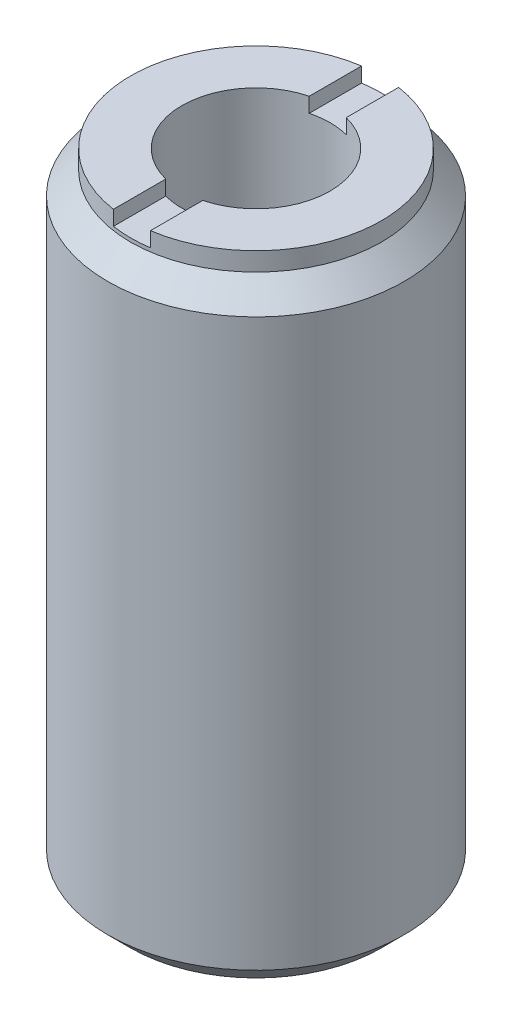
ISO-10303-21;
HEADER;
FILE_DESCRIPTION(('STEP AP214'),'2;1');
FILE_NAME('part.step','',(''),(''),'','','');
FILE_SCHEMA(('AUTOMOTIVE_DESIGN { 1 0 10303 214 1 1 1 1 }'));
ENDSEC;
DATA;
#1=APPLICATION_CONTEXT('core data for automotive mechanical design processes');
#2=APPLICATION_PROTOCOL_DEFINITION('international standard','automotive_design',2000,#1);
#3=PRODUCT_CONTEXT('',#1,'mechanical');
#4=PRODUCT('Part','Part','',(#3));
#5=PRODUCT_RELATED_PRODUCT_CATEGORY('part','',(#4));
#6=PRODUCT_DEFINITION_FORMATION('','',#4);
#7=PRODUCT_DEFINITION_CONTEXT('part definition',#1,'design');
#8=PRODUCT_DEFINITION('design','',#6,#7);
#9=PRODUCT_DEFINITION_SHAPE('','',#8);
#10=(LENGTH_UNIT() NAMED_UNIT(*) SI_UNIT(.MILLI.,.METRE.));
#11=(NAMED_UNIT(*) PLANE_ANGLE_UNIT() SI_UNIT($,.RADIAN.));
#12=(NAMED_UNIT(*) SI_UNIT($,.STERADIAN.) SOLID_ANGLE_UNIT());
#13=UNCERTAINTY_MEASURE_WITH_UNIT(LENGTH_MEASURE(1.E-05),#10,'distance_accuracy_value','');
#14=(GEOMETRIC_REPRESENTATION_CONTEXT(3) GLOBAL_UNCERTAINTY_ASSIGNED_CONTEXT((#13)) GLOBAL_UNIT_ASSIGNED_CONTEXT((#10,
#11,#12)) REPRESENTATION_CONTEXT('',''));
#15=CARTESIAN_POINT('',(0.,0.,0.));
#16=DIRECTION('',(0.,0.,1.));
#17=DIRECTION('',(1.,0.,0.));
#18=AXIS2_PLACEMENT_3D('',#15,#16,#17);
#19=CARTESIAN_POINT('',(0.,31.773,0.));
#20=DIRECTION('',(0.,-1.,0.));
#21=DIRECTION('',(0.,0.,-1.));
#22=AXIS2_PLACEMENT_3D('',#19,#20,#21);
#23=CONICAL_SURFACE('',#22,8.,0.785398163397449);
#24=CARTESIAN_POINT('',(0.,33.,0.));
#25=DIRECTION('',(0.,-1.,0.));
#26=DIRECTION('',(0.,0.,-1.));
#27=AXIS2_PLACEMENT_3D('',#24,#25,#26);
#28=CIRCLE('',#27,6.773);
#29=CARTESIAN_POINT('',(0.,33.,-6.773));
#30=VERTEX_POINT('',#29);
#31=EDGE_CURVE('E111',#30,#30,#28,.T.);
#32=ORIENTED_EDGE('',*,*,#31,.T.);
#33=EDGE_LOOP('',(#32));
#34=FACE_BOUND('',#33,.T.);
#35=CARTESIAN_POINT('',(0.,31.773,0.));
#36=DIRECTION('',(0.,-1.,0.));
#37=DIRECTION('',(0.,0.,-1.));
#38=AXIS2_PLACEMENT_3D('',#35,#36,#37);
#39=CIRCLE('',#38,8.);
#40=CARTESIAN_POINT('',(0.,31.773,-8.));
#41=VERTEX_POINT('',#40);
#42=EDGE_CURVE('E11',#41,#41,#39,.T.);
#43=ORIENTED_EDGE('',*,*,#42,.F.);
#44=EDGE_LOOP('',(#43));
#45=FACE_BOUND('',#44,.T.);
#46=ADVANCED_FACE('F17',(#34,#45),#23,.T.);
#47=CARTESIAN_POINT('',(0.,0.,0.));
#48=DIRECTION('',(0.,1.,0.));
#49=DIRECTION('',(0.,0.,-1.));
#50=AXIS2_PLACEMENT_3D('',#47,#48,#49);
#51=CYLINDRICAL_SURFACE('',#50,8.);
#52=ORIENTED_EDGE('',*,*,#42,.T.);
#53=EDGE_LOOP('',(#52));
#54=FACE_BOUND('',#53,.T.);
#55=CARTESIAN_POINT('',(0.,1.227,0.));
#56=DIRECTION('',(0.,-1.,0.));
#57=DIRECTION('',(0.,0.,-1.));
#58=AXIS2_PLACEMENT_3D('',#55,#56,#57);
#59=CIRCLE('',#58,8.);
#60=CARTESIAN_POINT('',(0.,1.227,-8.));
#61=VERTEX_POINT('',#60);
#62=EDGE_CURVE('E21',#61,#61,#59,.T.);
#63=ORIENTED_EDGE('',*,*,#62,.F.);
#64=EDGE_LOOP('',(#63));
#65=FACE_BOUND('',#64,.T.);
#66=ADVANCED_FACE('F205',(#54,#65),#51,.T.);
#67=CARTESIAN_POINT('',(0.,0.,0.));
#68=DIRECTION('',(0.,1.,0.));
#69=DIRECTION('',(0.,0.,1.));
#70=AXIS2_PLACEMENT_3D('',#67,#68,#69);
#71=CONICAL_SURFACE('',#70,6.773,0.785398163397448);
#72=CARTESIAN_POINT('',(0.,0.,0.));
#73=DIRECTION('',(0.,-1.,0.));
#74=DIRECTION('',(0.,0.,-1.));
#75=AXIS2_PLACEMENT_3D('',#72,#73,#74);
#76=CIRCLE('',#75,6.773);
#77=CARTESIAN_POINT('',(0.,0.,-6.773));
#78=VERTEX_POINT('',#77);
#79=EDGE_CURVE('E81',#78,#78,#76,.T.);
#80=ORIENTED_EDGE('',*,*,#79,.F.);
#81=EDGE_LOOP('',(#80));
#82=FACE_BOUND('',#81,.T.);
#83=ORIENTED_EDGE('',*,*,#62,.T.);
#84=EDGE_LOOP('',(#83));
#85=FACE_BOUND('',#84,.T.);
#86=ADVANCED_FACE('F211',(#82,#85),#71,.T.);
#87=CARTESIAN_POINT('',(4.,0.,0.));
#88=DIRECTION('',(0.,-1.,0.));
#89=DIRECTION('',(0.,0.,-1.));
#90=AXIS2_PLACEMENT_3D('',#87,#88,#89);
#91=PLANE('',#90);
#92=CARTESIAN_POINT('',(0.,0.,0.));
#93=DIRECTION('',(0.,-1.,0.));
#94=DIRECTION('',(0.,0.,-1.));
#95=AXIS2_PLACEMENT_3D('',#92,#93,#94);
#96=CIRCLE('',#95,4.);
#97=CARTESIAN_POINT('',(0.,0.,-4.));
#98=VERTEX_POINT('',#97);
#99=EDGE_CURVE('E125',#98,#98,#96,.T.);
#100=ORIENTED_EDGE('',*,*,#99,.F.);
#101=EDGE_LOOP('',(#100));
#102=FACE_BOUND('',#101,.T.);
#103=ORIENTED_EDGE('',*,*,#79,.T.);
#104=EDGE_LOOP('',(#103));
#105=FACE_BOUND('',#104,.T.);
#106=ADVANCED_FACE('F19',(#102,#105),#91,.T.);
#107=CARTESIAN_POINT('',(6.773,34.,0.));
#108=DIRECTION('',(0.,1.,0.));
#109=DIRECTION('',(1.,0.,0.));
#110=AXIS2_PLACEMENT_3D('',#107,#108,#109);
#111=PLANE('',#110);
#112=CARTESIAN_POINT('',(0.,34.,0.));
#113=DIRECTION('',(0.,-1.,0.));
#114=DIRECTION('',(0.,0.,-1.));
#115=AXIS2_PLACEMENT_3D('',#112,#113,#114);
#116=CIRCLE('',#115,6.773);
#117=CARTESIAN_POINT('',(-1.,34.,6.6987707081225));
#118=VERTEX_POINT('',#117);
#119=CARTESIAN_POINT('',(-1.,34.,-6.6987707081225));
#120=VERTEX_POINT('',#119);
#121=EDGE_CURVE('E100',#118,#120,#116,.T.);
#122=ORIENTED_EDGE('',*,*,#121,.F.);
#123=DIRECTION('',(0.,0.,-1.));
#124=VECTOR('',#123,1.);
#125=CARTESIAN_POINT('',(-1.,34.,0.));
#126=LINE('',#125,#124);
#127=CARTESIAN_POINT('',(-1.,34.,3.87298334620742));
#128=VERTEX_POINT('',#127);
#129=EDGE_CURVE('E83',#118,#128,#126,.T.);
#130=ORIENTED_EDGE('',*,*,#129,.T.);
#131=CARTESIAN_POINT('',(0.,34.,0.));
#132=DIRECTION('',(0.,-1.,0.));
#133=DIRECTION('',(0.,0.,-1.));
#134=AXIS2_PLACEMENT_3D('',#131,#132,#133);
#135=CIRCLE('',#134,4.);
#136=CARTESIAN_POINT('',(-1.,34.,-3.87298334620742));
#137=VERTEX_POINT('',#136);
#138=EDGE_CURVE('E136',#128,#137,#135,.T.);
#139=ORIENTED_EDGE('',*,*,#138,.T.);
#140=DIRECTION('',(0.,0.,-1.));
#141=VECTOR('',#140,1.);
#142=CARTESIAN_POINT('',(-1.,34.,0.));
#143=LINE('',#142,#141);
#144=EDGE_CURVE('E84',#137,#120,#143,.T.);
#145=ORIENTED_EDGE('',*,*,#144,.T.);
#146=EDGE_LOOP('',(#122,#130,#139,#145));
#147=FACE_BOUND('',#146,.T.);
#148=ADVANCED_FACE('F229',(#147),#111,.T.);
#149=CARTESIAN_POINT('',(-1.,34.,8.));
#150=DIRECTION('',(1.,0.,0.));
#151=DIRECTION('',(0.,1.,0.));
#152=AXIS2_PLACEMENT_3D('',#149,#150,#151);
#153=PLANE('',#152);
#154=ORIENTED_EDGE('',*,*,#129,.F.);
#155=DIRECTION('',(0.,1.,0.));
#156=VECTOR('',#155,1.);
#157=CARTESIAN_POINT('',(-1.,0.,6.6987707081225));
#158=LINE('',#157,#156);
#159=CARTESIAN_POINT('',(-1.,33.2,6.6987707081225));
#160=VERTEX_POINT('',#159);
#161=EDGE_CURVE('E103',#160,#118,#158,.T.);
#162=ORIENTED_EDGE('',*,*,#161,.F.);
#163=DIRECTION('',(0.,0.,-1.));
#164=VECTOR('',#163,1.);
#165=CARTESIAN_POINT('',(-1.,33.2,8.));
#166=LINE('',#165,#164);
#167=CARTESIAN_POINT('',(-1.,33.2,3.87298334620742));
#168=VERTEX_POINT('',#167);
#169=EDGE_CURVE('E92',#160,#168,#166,.T.);
#170=ORIENTED_EDGE('',*,*,#169,.T.);
#171=DIRECTION('',(0.,-1.,0.));
#172=VECTOR('',#171,1.);
#173=CARTESIAN_POINT('',(-1.,0.,3.87298334620742));
#174=LINE('',#173,#172);
#175=EDGE_CURVE('E130',#128,#168,#174,.T.);
#176=ORIENTED_EDGE('',*,*,#175,.F.);
#177=EDGE_LOOP('',(#154,#162,#170,#176));
#178=FACE_BOUND('',#177,.T.);
#179=ADVANCED_FACE('F186',(#178),#153,.T.);
#180=CARTESIAN_POINT('',(-1.,34.,8.));
#181=DIRECTION('',(1.,0.,0.));
#182=DIRECTION('',(0.,1.,0.));
#183=AXIS2_PLACEMENT_3D('',#180,#181,#182);
#184=PLANE('',#183);
#185=DIRECTION('',(0.,0.,-1.));
#186=VECTOR('',#185,1.);
#187=CARTESIAN_POINT('',(-1.,33.2,8.));
#188=LINE('',#187,#186);
#189=CARTESIAN_POINT('',(-1.,33.2,-3.87298334620742));
#190=VERTEX_POINT('',#189);
#191=CARTESIAN_POINT('',(-1.,33.2,-6.6987707081225));
#192=VERTEX_POINT('',#191);
#193=EDGE_CURVE('E88',#190,#192,#188,.T.);
#194=ORIENTED_EDGE('',*,*,#193,.T.);
#195=DIRECTION('',(0.,-1.,0.));
#196=VECTOR('',#195,1.);
#197=CARTESIAN_POINT('',(-1.,0.,-6.6987707081225));
#198=LINE('',#197,#196);
#199=EDGE_CURVE('E97',#120,#192,#198,.T.);
#200=ORIENTED_EDGE('',*,*,#199,.F.);
#201=ORIENTED_EDGE('',*,*,#144,.F.);
#202=DIRECTION('',(0.,1.,0.));
#203=VECTOR('',#202,1.);
#204=CARTESIAN_POINT('',(-1.,0.,-3.87298334620742));
#205=LINE('',#204,#203);
#206=EDGE_CURVE('E143',#190,#137,#205,.T.);
#207=ORIENTED_EDGE('',*,*,#206,.F.);
#208=EDGE_LOOP('',(#194,#200,#201,#207));
#209=FACE_BOUND('',#208,.T.);
#210=ADVANCED_FACE('F193',(#209),#184,.T.);
#211=CARTESIAN_POINT('',(1.,33.2,8.));
#212=DIRECTION('',(-1.,0.,0.));
#213=DIRECTION('',(0.,0.,1.));
#214=AXIS2_PLACEMENT_3D('',#211,#212,#213);
#215=PLANE('',#214);
#216=DIRECTION('',(0.,0.,1.));
#217=VECTOR('',#216,1.);
#218=CARTESIAN_POINT('',(1.,34.,0.));
#219=LINE('',#218,#217);
#220=CARTESIAN_POINT('',(1.,34.,-6.6987707081225));
#221=VERTEX_POINT('',#220);
#222=CARTESIAN_POINT('',(1.,34.,-3.87298334620742));
#223=VERTEX_POINT('',#222);
#224=EDGE_CURVE('E112',#221,#223,#219,.T.);
#225=ORIENTED_EDGE('',*,*,#224,.F.);
#226=DIRECTION('',(0.,1.,0.));
#227=VECTOR('',#226,1.);
#228=CARTESIAN_POINT('',(1.,0.,-6.6987707081225));
#229=LINE('',#228,#227);
#230=CARTESIAN_POINT('',(1.,33.2,-6.6987707081225));
#231=VERTEX_POINT('',#230);
#232=EDGE_CURVE('E109',#231,#221,#229,.T.);
#233=ORIENTED_EDGE('',*,*,#232,.F.);
#234=DIRECTION('',(0.,0.,-1.));
#235=VECTOR('',#234,1.);
#236=CARTESIAN_POINT('',(1.,33.2,8.));
#237=LINE('',#236,#235);
#238=CARTESIAN_POINT('',(1.,33.2,-3.87298334620742));
#239=VERTEX_POINT('',#238);
#240=EDGE_CURVE('E90',#239,#231,#237,.T.);
#241=ORIENTED_EDGE('',*,*,#240,.F.);
#242=DIRECTION('',(0.,-1.,0.));
#243=VECTOR('',#242,1.);
#244=CARTESIAN_POINT('',(1.,0.,-3.87298334620742));
#245=LINE('',#244,#243);
#246=EDGE_CURVE('E133',#223,#239,#245,.T.);
#247=ORIENTED_EDGE('',*,*,#246,.F.);
#248=EDGE_LOOP('',(#225,#233,#241,#247));
#249=FACE_BOUND('',#248,.T.);
#250=ADVANCED_FACE('F191',(#249),#215,.T.);
#251=CARTESIAN_POINT('',(-1.,33.2,8.));
#252=DIRECTION('',(0.,1.,0.));
#253=DIRECTION('',(1.,0.,0.));
#254=AXIS2_PLACEMENT_3D('',#251,#252,#253);
#255=PLANE('',#254);
#256=ORIENTED_EDGE('',*,*,#240,.T.);
#257=CARTESIAN_POINT('',(0.,33.2,0.));
#258=DIRECTION('',(0.,-1.,0.));
#259=DIRECTION('',(0.,0.,1.));
#260=AXIS2_PLACEMENT_3D('',#257,#258,#259);
#261=CIRCLE('',#260,6.773);
#262=EDGE_CURVE('E94',#192,#231,#261,.T.);
#263=ORIENTED_EDGE('',*,*,#262,.F.);
#264=ORIENTED_EDGE('',*,*,#193,.F.);
#265=CARTESIAN_POINT('',(0.,33.2,0.));
#266=DIRECTION('',(0.,1.,0.));
#267=DIRECTION('',(0.,0.,1.));
#268=AXIS2_PLACEMENT_3D('',#265,#266,#267);
#269=CIRCLE('',#268,4.);
#270=EDGE_CURVE('E147',#239,#190,#269,.T.);
#271=ORIENTED_EDGE('',*,*,#270,.F.);
#272=EDGE_LOOP('',(#256,#263,#264,#271));
#273=FACE_BOUND('',#272,.T.);
#274=ADVANCED_FACE('F162',(#273),#255,.T.);
#275=CARTESIAN_POINT('',(-1.,33.2,8.));
#276=DIRECTION('',(0.,1.,0.));
#277=DIRECTION('',(1.,0.,0.));
#278=AXIS2_PLACEMENT_3D('',#275,#276,#277);
#279=PLANE('',#278);
#280=ORIENTED_EDGE('',*,*,#169,.F.);
#281=CARTESIAN_POINT('',(0.,33.2,0.));
#282=DIRECTION('',(0.,-1.,0.));
#283=DIRECTION('',(0.,0.,1.));
#284=AXIS2_PLACEMENT_3D('',#281,#282,#283);
#285=CIRCLE('',#284,6.773);
#286=CARTESIAN_POINT('',(1.,33.2,6.6987707081225));
#287=VERTEX_POINT('',#286);
#288=EDGE_CURVE('E106',#287,#160,#285,.T.);
#289=ORIENTED_EDGE('',*,*,#288,.F.);
#290=DIRECTION('',(0.,0.,-1.));
#291=VECTOR('',#290,1.);
#292=CARTESIAN_POINT('',(1.,33.2,8.));
#293=LINE('',#292,#291);
#294=CARTESIAN_POINT('',(1.,33.2,3.87298334620742));
#295=VERTEX_POINT('',#294);
#296=EDGE_CURVE('E122',#287,#295,#293,.T.);
#297=ORIENTED_EDGE('',*,*,#296,.T.);
#298=CARTESIAN_POINT('',(0.,33.2,0.));
#299=DIRECTION('',(0.,1.,0.));
#300=DIRECTION('',(0.,0.,1.));
#301=AXIS2_PLACEMENT_3D('',#298,#299,#300);
#302=CIRCLE('',#301,4.);
#303=EDGE_CURVE('E126',#168,#295,#302,.T.);
#304=ORIENTED_EDGE('',*,*,#303,.F.);
#305=EDGE_LOOP('',(#280,#289,#297,#304));
#306=FACE_BOUND('',#305,.T.);
#307=ADVANCED_FACE('F183',(#306),#279,.T.);
#308=CARTESIAN_POINT('',(0.,0.,0.));
#309=DIRECTION('',(0.,1.,0.));
#310=DIRECTION('',(0.,0.,-1.));
#311=AXIS2_PLACEMENT_3D('',#308,#309,#310);
#312=CYLINDRICAL_SURFACE('',#311,6.773);
#313=ORIENTED_EDGE('',*,*,#232,.T.);
#314=CARTESIAN_POINT('',(0.,34.,0.));
#315=DIRECTION('',(0.,-1.,0.));
#316=DIRECTION('',(0.,0.,-1.));
#317=AXIS2_PLACEMENT_3D('',#314,#315,#316);
#318=CIRCLE('',#317,6.773);
#319=CARTESIAN_POINT('',(1.,34.,6.6987707081225));
#320=VERTEX_POINT('',#319);
#321=EDGE_CURVE('E114',#221,#320,#318,.T.);
#322=ORIENTED_EDGE('',*,*,#321,.T.);
#323=DIRECTION('',(0.,-1.,0.));
#324=VECTOR('',#323,1.);
#325=CARTESIAN_POINT('',(1.,0.,6.6987707081225));
#326=LINE('',#325,#324);
#327=EDGE_CURVE('E119',#320,#287,#326,.T.);
#328=ORIENTED_EDGE('',*,*,#327,.T.);
#329=ORIENTED_EDGE('',*,*,#288,.T.);
#330=ORIENTED_EDGE('',*,*,#161,.T.);
#331=ORIENTED_EDGE('',*,*,#121,.T.);
#332=ORIENTED_EDGE('',*,*,#199,.T.);
#333=ORIENTED_EDGE('',*,*,#262,.T.);
#334=EDGE_LOOP('',(#313,#322,#328,#329,#330,#331,#332,#333));
#335=FACE_BOUND('',#334,.T.);
#336=ORIENTED_EDGE('',*,*,#31,.F.);
#337=EDGE_LOOP('',(#336));
#338=FACE_BOUND('',#337,.T.);
#339=ADVANCED_FACE('F189',(#335,#338),#312,.T.);
#340=CARTESIAN_POINT('',(6.773,34.,0.));
#341=DIRECTION('',(0.,1.,0.));
#342=DIRECTION('',(1.,0.,0.));
#343=AXIS2_PLACEMENT_3D('',#340,#341,#342);
#344=PLANE('',#343);
#345=CARTESIAN_POINT('',(0.,34.,0.));
#346=DIRECTION('',(0.,-1.,0.));
#347=DIRECTION('',(0.,0.,-1.));
#348=AXIS2_PLACEMENT_3D('',#345,#346,#347);
#349=CIRCLE('',#348,4.);
#350=CARTESIAN_POINT('',(1.,34.,3.87298334620742));
#351=VERTEX_POINT('',#350);
#352=EDGE_CURVE('E139',#223,#351,#349,.T.);
#353=ORIENTED_EDGE('',*,*,#352,.T.);
#354=DIRECTION('',(0.,0.,1.));
#355=VECTOR('',#354,1.);
#356=CARTESIAN_POINT('',(1.,34.,0.));
#357=LINE('',#356,#355);
#358=EDGE_CURVE('E116',#351,#320,#357,.T.);
#359=ORIENTED_EDGE('',*,*,#358,.T.);
#360=ORIENTED_EDGE('',*,*,#321,.F.);
#361=ORIENTED_EDGE('',*,*,#224,.T.);
#362=EDGE_LOOP('',(#353,#359,#360,#361));
#363=FACE_BOUND('',#362,.T.);
#364=ADVANCED_FACE('F180',(#363),#344,.T.);
#365=CARTESIAN_POINT('',(1.,33.2,8.));
#366=DIRECTION('',(-1.,0.,0.));
#367=DIRECTION('',(0.,0.,1.));
#368=AXIS2_PLACEMENT_3D('',#365,#366,#367);
#369=PLANE('',#368);
#370=ORIENTED_EDGE('',*,*,#296,.F.);
#371=ORIENTED_EDGE('',*,*,#327,.F.);
#372=ORIENTED_EDGE('',*,*,#358,.F.);
#373=DIRECTION('',(0.,1.,0.));
#374=VECTOR('',#373,1.);
#375=CARTESIAN_POINT('',(1.,0.,3.87298334620742));
#376=LINE('',#375,#374);
#377=EDGE_CURVE('E129',#295,#351,#376,.T.);
#378=ORIENTED_EDGE('',*,*,#377,.F.);
#379=EDGE_LOOP('',(#370,#371,#372,#378));
#380=FACE_BOUND('',#379,.T.);
#381=ADVANCED_FACE('F177',(#380),#369,.T.);
#382=CARTESIAN_POINT('',(0.,0.,0.));
#383=DIRECTION('',(0.,1.,0.));
#384=DIRECTION('',(0.,0.,-1.));
#385=AXIS2_PLACEMENT_3D('',#382,#383,#384);
#386=CYLINDRICAL_SURFACE('',#385,4.);
#387=ORIENTED_EDGE('',*,*,#99,.T.);
#388=EDGE_LOOP('',(#387));
#389=FACE_BOUND('',#388,.T.);
#390=ORIENTED_EDGE('',*,*,#270,.T.);
#391=ORIENTED_EDGE('',*,*,#206,.T.);
#392=ORIENTED_EDGE('',*,*,#138,.F.);
#393=ORIENTED_EDGE('',*,*,#175,.T.);
#394=ORIENTED_EDGE('',*,*,#303,.T.);
#395=ORIENTED_EDGE('',*,*,#377,.T.);
#396=ORIENTED_EDGE('',*,*,#352,.F.);
#397=ORIENTED_EDGE('',*,*,#246,.T.);
#398=EDGE_LOOP('',(#390,#391,#392,#393,#394,#395,#396,#397));
#399=FACE_BOUND('',#398,.T.);
#400=ADVANCED_FACE('F154',(#389,#399),#386,.F.);
#401=CLOSED_SHELL('',(#46,#66,#86,#106,#148,#179,#210,#250,#274,#307,#339,#364,#381,#400));
#402=MANIFOLD_SOLID_BREP('B1',#401);
#403=ADVANCED_BREP_SHAPE_REPRESENTATION('',(#18,#402),#14);
#404=SHAPE_DEFINITION_REPRESENTATION(#9,#403);
ENDSEC;
END-ISO-10303-21;
